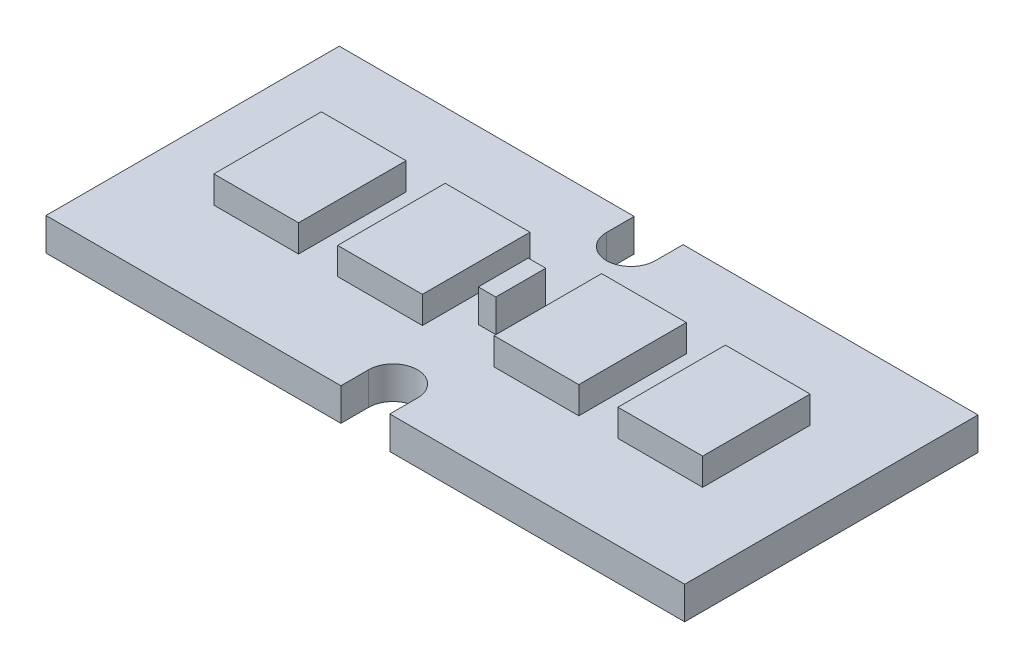
ISO-10303-21;
HEADER;
FILE_DESCRIPTION(('STEP AP214'),'2;1');
FILE_NAME('part.step','',(''),(''),'','','');
FILE_SCHEMA(('AUTOMOTIVE_DESIGN { 1 0 10303 214 1 1 1 1 }'));
ENDSEC;
DATA;
#1=APPLICATION_CONTEXT('core data for automotive mechanical design processes');
#2=APPLICATION_PROTOCOL_DEFINITION('international standard','automotive_design',2000,#1);
#3=PRODUCT_CONTEXT('',#1,'mechanical');
#4=PRODUCT('Part','Part','',(#3));
#5=PRODUCT_RELATED_PRODUCT_CATEGORY('part','',(#4));
#6=PRODUCT_DEFINITION_FORMATION('','',#4);
#7=PRODUCT_DEFINITION_CONTEXT('part definition',#1,'design');
#8=PRODUCT_DEFINITION('design','',#6,#7);
#9=PRODUCT_DEFINITION_SHAPE('','',#8);
#10=(LENGTH_UNIT() NAMED_UNIT(*) SI_UNIT(.MILLI.,.METRE.));
#11=(NAMED_UNIT(*) PLANE_ANGLE_UNIT() SI_UNIT($,.RADIAN.));
#12=(NAMED_UNIT(*) SI_UNIT($,.STERADIAN.) SOLID_ANGLE_UNIT());
#13=UNCERTAINTY_MEASURE_WITH_UNIT(LENGTH_MEASURE(1.E-05),#10,'distance_accuracy_value','');
#14=(GEOMETRIC_REPRESENTATION_CONTEXT(3) GLOBAL_UNCERTAINTY_ASSIGNED_CONTEXT((#13)) GLOBAL_UNIT_ASSIGNED_CONTEXT((#10,
#11,#12)) REPRESENTATION_CONTEXT('',''));
#15=CARTESIAN_POINT('',(0.,0.,0.));
#16=DIRECTION('',(0.,0.,1.));
#17=DIRECTION('',(1.,0.,0.));
#18=AXIS2_PLACEMENT_3D('',#15,#16,#17);
#19=CARTESIAN_POINT('',(0.,1.,0.));
#20=DIRECTION('',(0.,1.,0.));
#21=DIRECTION('',(0.,0.,1.));
#22=AXIS2_PLACEMENT_3D('',#19,#20,#21);
#23=PLANE('',#22);
#24=DIRECTION('',(0.,0.,1.));
#25=VECTOR('',#24,1.);
#26=CARTESIAN_POINT('',(7.5,1.,0.));
#27=LINE('',#26,#25);
#28=CARTESIAN_POINT('',(7.5,1.,-1.65));
#29=VERTEX_POINT('',#28);
#30=CARTESIAN_POINT('',(7.5,1.,1.65));
#31=VERTEX_POINT('',#30);
#32=EDGE_CURVE('E270',#29,#31,#27,.T.);
#33=ORIENTED_EDGE('',*,*,#32,.T.);
#34=DIRECTION('',(-1.,0.,0.));
#35=VECTOR('',#34,1.);
#36=CARTESIAN_POINT('',(0.,1.,1.65));
#37=LINE('',#36,#35);
#38=CARTESIAN_POINT('',(4.9,1.,1.65));
#39=VERTEX_POINT('',#38);
#40=EDGE_CURVE('E280',#31,#39,#37,.T.);
#41=ORIENTED_EDGE('',*,*,#40,.T.);
#42=DIRECTION('',(0.,0.,1.));
#43=VECTOR('',#42,1.);
#44=CARTESIAN_POINT('',(4.9,1.,0.));
#45=LINE('',#44,#43);
#46=CARTESIAN_POINT('',(4.9,1.,-1.65));
#47=VERTEX_POINT('',#46);
#48=EDGE_CURVE('E289',#47,#39,#45,.T.);
#49=ORIENTED_EDGE('',*,*,#48,.F.);
#50=DIRECTION('',(-1.,0.,0.));
#51=VECTOR('',#50,1.);
#52=CARTESIAN_POINT('',(0.,1.,-1.65));
#53=LINE('',#52,#51);
#54=EDGE_CURVE('E59',#29,#47,#53,.T.);
#55=ORIENTED_EDGE('',*,*,#54,.F.);
#56=EDGE_LOOP('',(#33,#41,#49,#55));
#57=FACE_BOUND('',#56,.T.);
#58=DIRECTION('',(0.,0.,1.));
#59=VECTOR('',#58,1.);
#60=CARTESIAN_POINT('',(3.7,1.,0.));
#61=LINE('',#60,#59);
#62=CARTESIAN_POINT('',(3.7,1.,-1.65));
#63=VERTEX_POINT('',#62);
#64=CARTESIAN_POINT('',(3.7,1.,1.65));
#65=VERTEX_POINT('',#64);
#66=EDGE_CURVE('E303',#63,#65,#61,.T.);
#67=ORIENTED_EDGE('',*,*,#66,.T.);
#68=DIRECTION('',(-1.,0.,0.));
#69=VECTOR('',#68,1.);
#70=CARTESIAN_POINT('',(0.,1.,1.65));
#71=LINE('',#70,#69);
#72=CARTESIAN_POINT('',(1.1,1.,1.65));
#73=VERTEX_POINT('',#72);
#74=EDGE_CURVE('E308',#65,#73,#71,.T.);
#75=ORIENTED_EDGE('',*,*,#74,.T.);
#76=DIRECTION('',(0.,0.,1.));
#77=VECTOR('',#76,1.);
#78=CARTESIAN_POINT('',(1.1,1.,0.));
#79=LINE('',#78,#77);
#80=CARTESIAN_POINT('',(1.1,1.,-1.65));
#81=VERTEX_POINT('',#80);
#82=EDGE_CURVE('E320',#81,#73,#79,.T.);
#83=ORIENTED_EDGE('',*,*,#82,.F.);
#84=DIRECTION('',(-1.,0.,0.));
#85=VECTOR('',#84,1.);
#86=CARTESIAN_POINT('',(0.,1.,-1.65));
#87=LINE('',#86,#85);
#88=EDGE_CURVE('E317',#63,#81,#87,.T.);
#89=ORIENTED_EDGE('',*,*,#88,.F.);
#90=EDGE_LOOP('',(#67,#75,#83,#89));
#91=FACE_BOUND('',#90,.T.);
#92=DIRECTION('',(0.,0.,1.));
#93=VECTOR('',#92,1.);
#94=CARTESIAN_POINT('',(-1.1,1.,0.));
#95=LINE('',#94,#93);
#96=CARTESIAN_POINT('',(-1.1,1.,-1.65));
#97=VERTEX_POINT('',#96);
#98=CARTESIAN_POINT('',(-1.1,1.,1.65));
#99=VERTEX_POINT('',#98);
#100=EDGE_CURVE('E335',#97,#99,#95,.T.);
#101=ORIENTED_EDGE('',*,*,#100,.T.);
#102=DIRECTION('',(1.,0.,0.));
#103=VECTOR('',#102,1.);
#104=CARTESIAN_POINT('',(0.,1.,1.65));
#105=LINE('',#104,#103);
#106=CARTESIAN_POINT('',(-3.7,1.,1.65));
#107=VERTEX_POINT('',#106);
#108=EDGE_CURVE('E340',#107,#99,#105,.T.);
#109=ORIENTED_EDGE('',*,*,#108,.F.);
#110=DIRECTION('',(0.,0.,1.));
#111=VECTOR('',#110,1.);
#112=CARTESIAN_POINT('',(-3.7,1.,0.));
#113=LINE('',#112,#111);
#114=CARTESIAN_POINT('',(-3.7,1.,-1.65));
#115=VERTEX_POINT('',#114);
#116=EDGE_CURVE('E353',#115,#107,#113,.T.);
#117=ORIENTED_EDGE('',*,*,#116,.F.);
#118=DIRECTION('',(1.,0.,0.));
#119=VECTOR('',#118,1.);
#120=CARTESIAN_POINT('',(0.,1.,-1.65));
#121=LINE('',#120,#119);
#122=EDGE_CURVE('E350',#115,#97,#121,.T.);
#123=ORIENTED_EDGE('',*,*,#122,.T.);
#124=EDGE_LOOP('',(#101,#109,#117,#123));
#125=FACE_BOUND('',#124,.T.);
#126=DIRECTION('',(0.,0.,1.));
#127=VECTOR('',#126,1.);
#128=CARTESIAN_POINT('',(-4.9,1.,0.));
#129=LINE('',#128,#127);
#130=CARTESIAN_POINT('',(-4.9,1.,-1.65));
#131=VERTEX_POINT('',#130);
#132=CARTESIAN_POINT('',(-4.9,1.,1.65));
#133=VERTEX_POINT('',#132);
#134=EDGE_CURVE('E365',#131,#133,#129,.T.);
#135=ORIENTED_EDGE('',*,*,#134,.T.);
#136=DIRECTION('',(1.,0.,0.));
#137=VECTOR('',#136,1.);
#138=CARTESIAN_POINT('',(0.,1.,1.65));
#139=LINE('',#138,#137);
#140=CARTESIAN_POINT('',(-7.5,1.,1.65));
#141=VERTEX_POINT('',#140);
#142=EDGE_CURVE('E370',#141,#133,#139,.T.);
#143=ORIENTED_EDGE('',*,*,#142,.F.);
#144=DIRECTION('',(0.,0.,1.));
#145=VECTOR('',#144,1.);
#146=CARTESIAN_POINT('',(-7.5,1.,0.));
#147=LINE('',#146,#145);
#148=CARTESIAN_POINT('',(-7.5,1.,-1.65));
#149=VERTEX_POINT('',#148);
#150=EDGE_CURVE('E383',#149,#141,#147,.T.);
#151=ORIENTED_EDGE('',*,*,#150,.F.);
#152=DIRECTION('',(1.,0.,0.));
#153=VECTOR('',#152,1.);
#154=CARTESIAN_POINT('',(0.,1.,-1.65));
#155=LINE('',#154,#153);
#156=EDGE_CURVE('E380',#149,#131,#155,.T.);
#157=ORIENTED_EDGE('',*,*,#156,.T.);
#158=EDGE_LOOP('',(#135,#143,#151,#157));
#159=FACE_BOUND('',#158,.T.);
#160=DIRECTION('',(0.,0.,1.));
#161=VECTOR('',#160,1.);
#162=CARTESIAN_POINT('',(-0.749999999999999,1.,0.));
#163=LINE('',#162,#161);
#164=CARTESIAN_POINT('',(-0.75,1.,-4.5));
#165=VERTEX_POINT('',#164);
#166=CARTESIAN_POINT('',(-0.75,1.,-3.65));
#167=VERTEX_POINT('',#166);
#168=EDGE_CURVE('E407',#165,#167,#163,.T.);
#169=ORIENTED_EDGE('',*,*,#168,.F.);
#170=DIRECTION('',(-1.,0.,0.));
#171=VECTOR('',#170,1.);
#172=CARTESIAN_POINT('',(-9.8,1.,-4.5));
#173=LINE('',#172,#171);
#174=CARTESIAN_POINT('',(-9.8,1.,-4.5));
#175=VERTEX_POINT('',#174);
#176=EDGE_CURVE('E451',#165,#175,#173,.T.);
#177=ORIENTED_EDGE('',*,*,#176,.T.);
#178=DIRECTION('',(0.,0.,1.));
#179=VECTOR('',#178,1.);
#180=CARTESIAN_POINT('',(-9.8,1.,-4.5));
#181=LINE('',#180,#179);
#182=CARTESIAN_POINT('',(-9.8,1.,4.5));
#183=VERTEX_POINT('',#182);
#184=EDGE_CURVE('E456',#175,#183,#181,.T.);
#185=ORIENTED_EDGE('',*,*,#184,.T.);
#186=DIRECTION('',(1.,0.,0.));
#187=VECTOR('',#186,1.);
#188=CARTESIAN_POINT('',(-9.8,1.,4.5));
#189=LINE('',#188,#187);
#190=CARTESIAN_POINT('',(-0.75,1.,4.5));
#191=VERTEX_POINT('',#190);
#192=EDGE_CURVE('E459',#183,#191,#189,.T.);
#193=ORIENTED_EDGE('',*,*,#192,.T.);
#194=DIRECTION('',(0.,0.,-1.));
#195=VECTOR('',#194,1.);
#196=CARTESIAN_POINT('',(-0.749999999999999,1.,0.));
#197=LINE('',#196,#195);
#198=CARTESIAN_POINT('',(-0.75,1.,3.65));
#199=VERTEX_POINT('',#198);
#200=EDGE_CURVE('E436',#191,#199,#197,.T.);
#201=ORIENTED_EDGE('',*,*,#200,.T.);
#202=CARTESIAN_POINT('',(0.,1.,3.65));
#203=DIRECTION('',(0.,1.,0.));
#204=DIRECTION('',(0.,0.,1.));
#205=AXIS2_PLACEMENT_3D('',#202,#203,#204);
#206=CIRCLE('',#205,0.75);
#207=CARTESIAN_POINT('',(0.75,1.,3.65));
#208=VERTEX_POINT('',#207);
#209=EDGE_CURVE('E395',#199,#208,#206,.F.);
#210=ORIENTED_EDGE('',*,*,#209,.T.);
#211=DIRECTION('',(0.,0.,-1.));
#212=VECTOR('',#211,1.);
#213=CARTESIAN_POINT('',(0.75,1.,0.));
#214=LINE('',#213,#212);
#215=CARTESIAN_POINT('',(0.75,1.,4.5));
#216=VERTEX_POINT('',#215);
#217=EDGE_CURVE('E428',#216,#208,#214,.T.);
#218=ORIENTED_EDGE('',*,*,#217,.F.);
#219=CARTESIAN_POINT('',(9.8,1.,4.5));
#220=VERTEX_POINT('',#219);
#221=EDGE_CURVE('E458',#216,#220,#189,.T.);
#222=ORIENTED_EDGE('',*,*,#221,.T.);
#223=DIRECTION('',(0.,0.,-1.));
#224=VECTOR('',#223,1.);
#225=CARTESIAN_POINT('',(9.8,1.,-4.5));
#226=LINE('',#225,#224);
#227=CARTESIAN_POINT('',(9.8,1.,-4.5));
#228=VERTEX_POINT('',#227);
#229=EDGE_CURVE('E448',#220,#228,#226,.T.);
#230=ORIENTED_EDGE('',*,*,#229,.T.);
#231=CARTESIAN_POINT('',(0.75,1.,-4.5));
#232=VERTEX_POINT('',#231);
#233=EDGE_CURVE('E453',#228,#232,#173,.T.);
#234=ORIENTED_EDGE('',*,*,#233,.T.);
#235=DIRECTION('',(0.,0.,1.));
#236=VECTOR('',#235,1.);
#237=CARTESIAN_POINT('',(0.75,1.,0.));
#238=LINE('',#237,#236);
#239=CARTESIAN_POINT('',(0.75,1.,-3.65));
#240=VERTEX_POINT('',#239);
#241=EDGE_CURVE('E400',#232,#240,#238,.T.);
#242=ORIENTED_EDGE('',*,*,#241,.T.);
#243=CARTESIAN_POINT('',(0.,1.,-3.65));
#244=DIRECTION('',(0.,1.,0.));
#245=DIRECTION('',(0.,0.,1.));
#246=AXIS2_PLACEMENT_3D('',#243,#244,#245);
#247=CIRCLE('',#246,0.75);
#248=EDGE_CURVE('E410',#167,#240,#247,.T.);
#249=ORIENTED_EDGE('',*,*,#248,.F.);
#250=EDGE_LOOP('',(#169,#177,#185,#193,#201,#210,#218,#222,#230,#234,#242,#249));
#251=FACE_BOUND('',#250,.T.);
#252=DIRECTION('',(-1.,0.,0.));
#253=VECTOR('',#252,1.);
#254=CARTESIAN_POINT('',(-0.268785812417193,1.,-0.765005773802785));
#255=LINE('',#254,#253);
#256=CARTESIAN_POINT('',(0.268785812417193,1.,-0.765005773802785));
#257=VERTEX_POINT('',#256);
#258=CARTESIAN_POINT('',(-0.268785812417193,1.,-0.765005773802785));
#259=VERTEX_POINT('',#258);
#260=EDGE_CURVE('E890',#257,#259,#255,.T.);
#261=ORIENTED_EDGE('',*,*,#260,.F.);
#262=DIRECTION('',(0.,0.,-1.));
#263=VECTOR('',#262,1.);
#264=CARTESIAN_POINT('',(0.268785812417193,1.,-0.765005773802785));
#265=LINE('',#264,#263);
#266=CARTESIAN_POINT('',(0.268785812417193,1.,0.765005773802785));
#267=VERTEX_POINT('',#266);
#268=EDGE_CURVE('E268',#267,#257,#265,.T.);
#269=ORIENTED_EDGE('',*,*,#268,.F.);
#270=DIRECTION('',(1.,0.,0.));
#271=VECTOR('',#270,1.);
#272=CARTESIAN_POINT('',(-0.268785812417193,1.,0.765005773802785));
#273=LINE('',#272,#271);
#274=CARTESIAN_POINT('',(-0.268785812417193,1.,0.765005773802785));
#275=VERTEX_POINT('',#274);
#276=EDGE_CURVE('E264',#275,#267,#273,.T.);
#277=ORIENTED_EDGE('',*,*,#276,.F.);
#278=DIRECTION('',(0.,0.,1.));
#279=VECTOR('',#278,1.);
#280=CARTESIAN_POINT('',(-0.268785812417193,1.,-0.765005773802785));
#281=LINE('',#280,#279);
#282=EDGE_CURVE('E887',#259,#275,#281,.T.);
#283=ORIENTED_EDGE('',*,*,#282,.F.);
#284=EDGE_LOOP('',(#261,#269,#277,#283));
#285=FACE_BOUND('',#284,.T.);
#286=ADVANCED_FACE('F36',(#57,#91,#125,#159,#251,#285),#23,.T.);
#287=CARTESIAN_POINT('',(-9.8,1.,-4.5));
#288=DIRECTION('',(0.,0.,1.));
#289=DIRECTION('',(1.,0.,0.));
#290=AXIS2_PLACEMENT_3D('',#287,#288,#289);
#291=PLANE('',#290);
#292=DIRECTION('',(0.,1.,0.));
#293=VECTOR('',#292,1.);
#294=CARTESIAN_POINT('',(0.75,0.,-4.5));
#295=LINE('',#294,#293);
#296=CARTESIAN_POINT('',(0.75,0.,-4.5));
#297=VERTEX_POINT('',#296);
#298=EDGE_CURVE('E419',#297,#232,#295,.T.);
#299=ORIENTED_EDGE('',*,*,#298,.T.);
#300=ORIENTED_EDGE('',*,*,#233,.F.);
#301=DIRECTION('',(0.,-1.,0.));
#302=VECTOR('',#301,1.);
#303=CARTESIAN_POINT('',(9.8,1.,-4.5));
#304=LINE('',#303,#302);
#305=CARTESIAN_POINT('',(9.8,0.,-4.5));
#306=VERTEX_POINT('',#305);
#307=EDGE_CURVE('E11',#228,#306,#304,.T.);
#308=ORIENTED_EDGE('',*,*,#307,.T.);
#309=DIRECTION('',(-1.,0.,0.));
#310=VECTOR('',#309,1.);
#311=CARTESIAN_POINT('',(-9.8,0.,-4.5));
#312=LINE('',#311,#310);
#313=EDGE_CURVE('E466',#306,#297,#312,.T.);
#314=ORIENTED_EDGE('',*,*,#313,.T.);
#315=EDGE_LOOP('',(#299,#300,#308,#314));
#316=FACE_BOUND('',#315,.T.);
#317=ADVANCED_FACE('F511',(#316),#291,.F.);
#318=CARTESIAN_POINT('',(-9.8,1.,4.5));
#319=DIRECTION('',(0.,0.,-1.));
#320=DIRECTION('',(-1.,0.,0.));
#321=AXIS2_PLACEMENT_3D('',#318,#319,#320);
#322=PLANE('',#321);
#323=DIRECTION('',(0.,1.,0.));
#324=VECTOR('',#323,1.);
#325=CARTESIAN_POINT('',(-0.75,0.,4.5));
#326=LINE('',#325,#324);
#327=CARTESIAN_POINT('',(-0.750000000000001,0.,4.5));
#328=VERTEX_POINT('',#327);
#329=EDGE_CURVE('E444',#328,#191,#326,.T.);
#330=ORIENTED_EDGE('',*,*,#329,.T.);
#331=ORIENTED_EDGE('',*,*,#192,.F.);
#332=DIRECTION('',(0.,-1.,0.));
#333=VECTOR('',#332,1.);
#334=CARTESIAN_POINT('',(-9.8,1.,4.5));
#335=LINE('',#334,#333);
#336=CARTESIAN_POINT('',(-9.8,0.,4.5));
#337=VERTEX_POINT('',#336);
#338=EDGE_CURVE('E476',#183,#337,#335,.T.);
#339=ORIENTED_EDGE('',*,*,#338,.T.);
#340=DIRECTION('',(1.,0.,0.));
#341=VECTOR('',#340,1.);
#342=CARTESIAN_POINT('',(-9.8,0.,4.5));
#343=LINE('',#342,#341);
#344=EDGE_CURVE('E452',#337,#328,#343,.T.);
#345=ORIENTED_EDGE('',*,*,#344,.T.);
#346=EDGE_LOOP('',(#330,#331,#339,#345));
#347=FACE_BOUND('',#346,.T.);
#348=ADVANCED_FACE('F494',(#347),#322,.F.);
#349=CARTESIAN_POINT('',(9.8,1.,-4.5));
#350=DIRECTION('',(-1.,0.,0.));
#351=DIRECTION('',(0.,0.,1.));
#352=AXIS2_PLACEMENT_3D('',#349,#350,#351);
#353=PLANE('',#352);
#354=DIRECTION('',(0.,0.,-1.));
#355=VECTOR('',#354,1.);
#356=CARTESIAN_POINT('',(9.8,0.,-4.5));
#357=LINE('',#356,#355);
#358=CARTESIAN_POINT('',(9.8,0.,4.5));
#359=VERTEX_POINT('',#358);
#360=EDGE_CURVE('E418',#359,#306,#357,.T.);
#361=ORIENTED_EDGE('',*,*,#360,.T.);
#362=ORIENTED_EDGE('',*,*,#307,.F.);
#363=ORIENTED_EDGE('',*,*,#229,.F.);
#364=DIRECTION('',(0.,-1.,0.));
#365=VECTOR('',#364,1.);
#366=CARTESIAN_POINT('',(9.8,1.,4.5));
#367=LINE('',#366,#365);
#368=EDGE_CURVE('E462',#220,#359,#367,.T.);
#369=ORIENTED_EDGE('',*,*,#368,.T.);
#370=EDGE_LOOP('',(#361,#362,#363,#369));
#371=FACE_BOUND('',#370,.T.);
#372=ADVANCED_FACE('F38',(#371),#353,.F.);
#373=ORIENTED_EDGE('',*,*,#176,.F.);
#374=DIRECTION('',(0.,1.,0.));
#375=VECTOR('',#374,1.);
#376=CARTESIAN_POINT('',(-0.75,0.,-4.5));
#377=LINE('',#376,#375);
#378=CARTESIAN_POINT('',(-0.75,0.,-4.5));
#379=VERTEX_POINT('',#378);
#380=EDGE_CURVE('E416',#379,#165,#377,.T.);
#381=ORIENTED_EDGE('',*,*,#380,.F.);
#382=CARTESIAN_POINT('',(-9.8,0.,-4.5));
#383=VERTEX_POINT('',#382);
#384=EDGE_CURVE('E465',#379,#383,#312,.T.);
#385=ORIENTED_EDGE('',*,*,#384,.T.);
#386=DIRECTION('',(0.,-1.,0.));
#387=VECTOR('',#386,1.);
#388=CARTESIAN_POINT('',(-9.8,1.,-4.5));
#389=LINE('',#388,#387);
#390=EDGE_CURVE('E44',#175,#383,#389,.T.);
#391=ORIENTED_EDGE('',*,*,#390,.F.);
#392=EDGE_LOOP('',(#373,#381,#385,#391));
#393=FACE_BOUND('',#392,.T.);
#394=ADVANCED_FACE('F501',(#393),#291,.F.);
#395=CARTESIAN_POINT('',(-9.8,1.,-4.5));
#396=DIRECTION('',(1.,0.,0.));
#397=DIRECTION('',(0.,0.,-1.));
#398=AXIS2_PLACEMENT_3D('',#395,#396,#397);
#399=PLANE('',#398);
#400=DIRECTION('',(0.,0.,1.));
#401=VECTOR('',#400,1.);
#402=CARTESIAN_POINT('',(-9.8,0.,-4.5));
#403=LINE('',#402,#401);
#404=EDGE_CURVE('E469',#383,#337,#403,.T.);
#405=ORIENTED_EDGE('',*,*,#404,.T.);
#406=ORIENTED_EDGE('',*,*,#338,.F.);
#407=ORIENTED_EDGE('',*,*,#184,.F.);
#408=ORIENTED_EDGE('',*,*,#390,.T.);
#409=EDGE_LOOP('',(#405,#406,#407,#408));
#410=FACE_BOUND('',#409,.T.);
#411=ADVANCED_FACE('F483',(#410),#399,.F.);
#412=ORIENTED_EDGE('',*,*,#221,.F.);
#413=DIRECTION('',(0.,1.,0.));
#414=VECTOR('',#413,1.);
#415=CARTESIAN_POINT('',(0.75,0.,4.5));
#416=LINE('',#415,#414);
#417=CARTESIAN_POINT('',(0.75,0.,4.5));
#418=VERTEX_POINT('',#417);
#419=EDGE_CURVE('E442',#418,#216,#416,.T.);
#420=ORIENTED_EDGE('',*,*,#419,.F.);
#421=EDGE_CURVE('E471',#418,#359,#343,.T.);
#422=ORIENTED_EDGE('',*,*,#421,.T.);
#423=ORIENTED_EDGE('',*,*,#368,.F.);
#424=EDGE_LOOP('',(#412,#420,#422,#423));
#425=FACE_BOUND('',#424,.T.);
#426=ADVANCED_FACE('F522',(#425),#322,.F.);
#427=CARTESIAN_POINT('',(0.,0.,0.));
#428=DIRECTION('',(0.,1.,0.));
#429=DIRECTION('',(0.,0.,1.));
#430=AXIS2_PLACEMENT_3D('',#427,#428,#429);
#431=PLANE('',#430);
#432=ORIENTED_EDGE('',*,*,#384,.F.);
#433=DIRECTION('',(0.,0.,1.));
#434=VECTOR('',#433,1.);
#435=CARTESIAN_POINT('',(-0.749999999999999,0.,0.));
#436=LINE('',#435,#434);
#437=CARTESIAN_POINT('',(-0.75,0.,-3.65));
#438=VERTEX_POINT('',#437);
#439=EDGE_CURVE('E396',#379,#438,#436,.T.);
#440=ORIENTED_EDGE('',*,*,#439,.T.);
#441=CARTESIAN_POINT('',(0.,0.,-3.65));
#442=DIRECTION('',(0.,1.,0.));
#443=DIRECTION('',(0.,0.,1.));
#444=AXIS2_PLACEMENT_3D('',#441,#442,#443);
#445=CIRCLE('',#444,0.75);
#446=CARTESIAN_POINT('',(0.75,0.,-3.65));
#447=VERTEX_POINT('',#446);
#448=EDGE_CURVE('E399',#438,#447,#445,.T.);
#449=ORIENTED_EDGE('',*,*,#448,.T.);
#450=DIRECTION('',(0.,0.,1.));
#451=VECTOR('',#450,1.);
#452=CARTESIAN_POINT('',(0.75,0.,0.));
#453=LINE('',#452,#451);
#454=EDGE_CURVE('E403',#297,#447,#453,.T.);
#455=ORIENTED_EDGE('',*,*,#454,.F.);
#456=ORIENTED_EDGE('',*,*,#313,.F.);
#457=ORIENTED_EDGE('',*,*,#360,.F.);
#458=ORIENTED_EDGE('',*,*,#421,.F.);
#459=DIRECTION('',(0.,0.,-1.));
#460=VECTOR('',#459,1.);
#461=CARTESIAN_POINT('',(0.75,0.,0.));
#462=LINE('',#461,#460);
#463=CARTESIAN_POINT('',(0.75,0.,3.65));
#464=VERTEX_POINT('',#463);
#465=EDGE_CURVE('E430',#418,#464,#462,.T.);
#466=ORIENTED_EDGE('',*,*,#465,.T.);
#467=CARTESIAN_POINT('',(0.,0.,3.65));
#468=DIRECTION('',(0.,1.,0.));
#469=DIRECTION('',(0.,0.,1.));
#470=AXIS2_PLACEMENT_3D('',#467,#468,#469);
#471=CIRCLE('',#470,0.75);
#472=CARTESIAN_POINT('',(-0.75,0.,3.65));
#473=VERTEX_POINT('',#472);
#474=EDGE_CURVE('E425',#473,#464,#471,.F.);
#475=ORIENTED_EDGE('',*,*,#474,.F.);
#476=DIRECTION('',(0.,0.,-1.));
#477=VECTOR('',#476,1.);
#478=CARTESIAN_POINT('',(-0.749999999999999,0.,0.));
#479=LINE('',#478,#477);
#480=EDGE_CURVE('E427',#328,#473,#479,.T.);
#481=ORIENTED_EDGE('',*,*,#480,.F.);
#482=ORIENTED_EDGE('',*,*,#344,.F.);
#483=ORIENTED_EDGE('',*,*,#404,.F.);
#484=EDGE_LOOP('',(#432,#440,#449,#455,#456,#457,#458,#466,#475,#481,#482,#483));
#485=FACE_BOUND('',#484,.T.);
#486=ADVANCED_FACE('F490',(#485),#431,.F.);
#487=CARTESIAN_POINT('',(0.,0.,3.65));
#488=DIRECTION('',(0.,1.,0.));
#489=DIRECTION('',(0.,0.,1.));
#490=AXIS2_PLACEMENT_3D('',#487,#488,#489);
#491=CYLINDRICAL_SURFACE('',#490,0.75);
#492=ORIENTED_EDGE('',*,*,#209,.F.);
#493=DIRECTION('',(0.,1.,0.));
#494=VECTOR('',#493,1.);
#495=CARTESIAN_POINT('',(-0.75,0.,3.65));
#496=LINE('',#495,#494);
#497=EDGE_CURVE('E433',#473,#199,#496,.T.);
#498=ORIENTED_EDGE('',*,*,#497,.F.);
#499=ORIENTED_EDGE('',*,*,#474,.T.);
#500=DIRECTION('',(0.,1.,0.));
#501=VECTOR('',#500,1.);
#502=CARTESIAN_POINT('',(0.75,0.,3.65));
#503=LINE('',#502,#501);
#504=EDGE_CURVE('E411',#464,#208,#503,.T.);
#505=ORIENTED_EDGE('',*,*,#504,.T.);
#506=EDGE_LOOP('',(#492,#498,#499,#505));
#507=FACE_BOUND('',#506,.T.);
#508=ADVANCED_FACE('F529',(#507),#491,.F.);
#509=CARTESIAN_POINT('',(0.75,0.,0.));
#510=DIRECTION('',(1.,0.,0.));
#511=DIRECTION('',(0.,0.,-1.));
#512=AXIS2_PLACEMENT_3D('',#509,#510,#511);
#513=PLANE('',#512);
#514=ORIENTED_EDGE('',*,*,#217,.T.);
#515=ORIENTED_EDGE('',*,*,#504,.F.);
#516=ORIENTED_EDGE('',*,*,#465,.F.);
#517=ORIENTED_EDGE('',*,*,#419,.T.);
#518=EDGE_LOOP('',(#514,#515,#516,#517));
#519=FACE_BOUND('',#518,.T.);
#520=ADVANCED_FACE('F524',(#519),#513,.F.);
#521=CARTESIAN_POINT('',(-0.749999999999999,0.,0.));
#522=DIRECTION('',(1.,0.,0.));
#523=DIRECTION('',(0.,0.,-1.));
#524=AXIS2_PLACEMENT_3D('',#521,#522,#523);
#525=PLANE('',#524);
#526=ORIENTED_EDGE('',*,*,#200,.F.);
#527=ORIENTED_EDGE('',*,*,#329,.F.);
#528=ORIENTED_EDGE('',*,*,#480,.T.);
#529=ORIENTED_EDGE('',*,*,#497,.T.);
#530=EDGE_LOOP('',(#526,#527,#528,#529));
#531=FACE_BOUND('',#530,.T.);
#532=ADVANCED_FACE('F531',(#531),#525,.T.);
#533=CARTESIAN_POINT('',(-0.749999999999999,0.,0.));
#534=DIRECTION('',(-1.,0.,0.));
#535=DIRECTION('',(0.,0.,1.));
#536=AXIS2_PLACEMENT_3D('',#533,#534,#535);
#537=PLANE('',#536);
#538=ORIENTED_EDGE('',*,*,#168,.T.);
#539=DIRECTION('',(0.,1.,0.));
#540=VECTOR('',#539,1.);
#541=CARTESIAN_POINT('',(-0.75,0.,-3.65));
#542=LINE('',#541,#540);
#543=EDGE_CURVE('E406',#438,#167,#542,.T.);
#544=ORIENTED_EDGE('',*,*,#543,.F.);
#545=ORIENTED_EDGE('',*,*,#439,.F.);
#546=ORIENTED_EDGE('',*,*,#380,.T.);
#547=EDGE_LOOP('',(#538,#544,#545,#546));
#548=FACE_BOUND('',#547,.T.);
#549=ADVANCED_FACE('F503',(#548),#537,.F.);
#550=CARTESIAN_POINT('',(0.75,0.,0.));
#551=DIRECTION('',(-1.,0.,0.));
#552=DIRECTION('',(0.,0.,1.));
#553=AXIS2_PLACEMENT_3D('',#550,#551,#552);
#554=PLANE('',#553);
#555=ORIENTED_EDGE('',*,*,#241,.F.);
#556=ORIENTED_EDGE('',*,*,#298,.F.);
#557=ORIENTED_EDGE('',*,*,#454,.T.);
#558=DIRECTION('',(0.,1.,0.));
#559=VECTOR('',#558,1.);
#560=CARTESIAN_POINT('',(0.75,0.,-3.65));
#561=LINE('',#560,#559);
#562=EDGE_CURVE('E422',#447,#240,#561,.T.);
#563=ORIENTED_EDGE('',*,*,#562,.T.);
#564=EDGE_LOOP('',(#555,#556,#557,#563));
#565=FACE_BOUND('',#564,.T.);
#566=ADVANCED_FACE('F509',(#565),#554,.T.);
#567=CARTESIAN_POINT('',(0.,0.,-3.65));
#568=DIRECTION('',(0.,1.,0.));
#569=DIRECTION('',(0.,0.,1.));
#570=AXIS2_PLACEMENT_3D('',#567,#568,#569);
#571=CYLINDRICAL_SURFACE('',#570,0.75);
#572=ORIENTED_EDGE('',*,*,#248,.T.);
#573=ORIENTED_EDGE('',*,*,#562,.F.);
#574=ORIENTED_EDGE('',*,*,#448,.F.);
#575=ORIENTED_EDGE('',*,*,#543,.T.);
#576=EDGE_LOOP('',(#572,#573,#574,#575));
#577=FACE_BOUND('',#576,.T.);
#578=ADVANCED_FACE('F507',(#577),#571,.F.);
#579=CARTESIAN_POINT('',(-4.9,1.83,0.));
#580=DIRECTION('',(1.,0.,0.));
#581=DIRECTION('',(0.,0.,-1.));
#582=AXIS2_PLACEMENT_3D('',#579,#580,#581);
#583=PLANE('',#582);
#584=ORIENTED_EDGE('',*,*,#134,.F.);
#585=DIRECTION('',(0.,-1.,0.));
#586=VECTOR('',#585,1.);
#587=CARTESIAN_POINT('',(-4.9,1.83,-1.65));
#588=LINE('',#587,#586);
#589=CARTESIAN_POINT('',(-4.9,1.83,-1.65));
#590=VERTEX_POINT('',#589);
#591=EDGE_CURVE('E393',#590,#131,#588,.T.);
#592=ORIENTED_EDGE('',*,*,#591,.F.);
#593=DIRECTION('',(0.,0.,1.));
#594=VECTOR('',#593,1.);
#595=CARTESIAN_POINT('',(-4.9,1.83,0.));
#596=LINE('',#595,#594);
#597=CARTESIAN_POINT('',(-4.9,1.83,1.65));
#598=VERTEX_POINT('',#597);
#599=EDGE_CURVE('E366',#590,#598,#596,.T.);
#600=ORIENTED_EDGE('',*,*,#599,.T.);
#601=DIRECTION('',(0.,-1.,0.));
#602=VECTOR('',#601,1.);
#603=CARTESIAN_POINT('',(-4.9,1.83,1.65));
#604=LINE('',#603,#602);
#605=EDGE_CURVE('E377',#598,#133,#604,.T.);
#606=ORIENTED_EDGE('',*,*,#605,.T.);
#607=EDGE_LOOP('',(#584,#592,#600,#606));
#608=FACE_BOUND('',#607,.T.);
#609=ADVANCED_FACE('F632',(#608),#583,.T.);
#610=CARTESIAN_POINT('',(0.,1.83,-1.65));
#611=DIRECTION('',(0.,0.,-1.));
#612=DIRECTION('',(-1.,0.,0.));
#613=AXIS2_PLACEMENT_3D('',#610,#611,#612);
#614=PLANE('',#613);
#615=ORIENTED_EDGE('',*,*,#156,.F.);
#616=DIRECTION('',(0.,-1.,0.));
#617=VECTOR('',#616,1.);
#618=CARTESIAN_POINT('',(-7.5,1.83,-1.65));
#619=LINE('',#618,#617);
#620=CARTESIAN_POINT('',(-7.5,1.83,-1.65));
#621=VERTEX_POINT('',#620);
#622=EDGE_CURVE('E391',#621,#149,#619,.T.);
#623=ORIENTED_EDGE('',*,*,#622,.F.);
#624=DIRECTION('',(1.,0.,0.));
#625=VECTOR('',#624,1.);
#626=CARTESIAN_POINT('',(0.,1.83,-1.65));
#627=LINE('',#626,#625);
#628=EDGE_CURVE('E369',#621,#590,#627,.T.);
#629=ORIENTED_EDGE('',*,*,#628,.T.);
#630=ORIENTED_EDGE('',*,*,#591,.T.);
#631=EDGE_LOOP('',(#615,#623,#629,#630));
#632=FACE_BOUND('',#631,.T.);
#633=ADVANCED_FACE('F641',(#632),#614,.T.);
#634=CARTESIAN_POINT('',(-7.5,1.83,0.));
#635=DIRECTION('',(1.,0.,0.));
#636=DIRECTION('',(0.,0.,-1.));
#637=AXIS2_PLACEMENT_3D('',#634,#635,#636);
#638=PLANE('',#637);
#639=ORIENTED_EDGE('',*,*,#150,.T.);
#640=DIRECTION('',(0.,-1.,0.));
#641=VECTOR('',#640,1.);
#642=CARTESIAN_POINT('',(-7.5,1.83,1.65));
#643=LINE('',#642,#641);
#644=CARTESIAN_POINT('',(-7.5,1.83,1.65));
#645=VERTEX_POINT('',#644);
#646=EDGE_CURVE('E389',#645,#141,#643,.T.);
#647=ORIENTED_EDGE('',*,*,#646,.F.);
#648=DIRECTION('',(0.,0.,1.));
#649=VECTOR('',#648,1.);
#650=CARTESIAN_POINT('',(-7.5,1.83,0.));
#651=LINE('',#650,#649);
#652=EDGE_CURVE('E373',#621,#645,#651,.T.);
#653=ORIENTED_EDGE('',*,*,#652,.F.);
#654=ORIENTED_EDGE('',*,*,#622,.T.);
#655=EDGE_LOOP('',(#639,#647,#653,#654));
#656=FACE_BOUND('',#655,.T.);
#657=ADVANCED_FACE('F651',(#656),#638,.F.);
#658=CARTESIAN_POINT('',(0.,1.83,1.65));
#659=DIRECTION('',(0.,0.,-1.));
#660=DIRECTION('',(-1.,0.,0.));
#661=AXIS2_PLACEMENT_3D('',#658,#659,#660);
#662=PLANE('',#661);
#663=ORIENTED_EDGE('',*,*,#142,.T.);
#664=ORIENTED_EDGE('',*,*,#605,.F.);
#665=DIRECTION('',(1.,0.,0.));
#666=VECTOR('',#665,1.);
#667=CARTESIAN_POINT('',(0.,1.83,1.65));
#668=LINE('',#667,#666);
#669=EDGE_CURVE('E375',#645,#598,#668,.T.);
#670=ORIENTED_EDGE('',*,*,#669,.F.);
#671=ORIENTED_EDGE('',*,*,#646,.T.);
#672=EDGE_LOOP('',(#663,#664,#670,#671));
#673=FACE_BOUND('',#672,.T.);
#674=ADVANCED_FACE('F661',(#673),#662,.F.);
#675=CARTESIAN_POINT('',(0.,1.83,0.));
#676=DIRECTION('',(0.,1.,0.));
#677=DIRECTION('',(0.,0.,1.));
#678=AXIS2_PLACEMENT_3D('',#675,#676,#677);
#679=PLANE('',#678);
#680=ORIENTED_EDGE('',*,*,#599,.F.);
#681=ORIENTED_EDGE('',*,*,#628,.F.);
#682=ORIENTED_EDGE('',*,*,#652,.T.);
#683=ORIENTED_EDGE('',*,*,#669,.T.);
#684=EDGE_LOOP('',(#680,#681,#682,#683));
#685=FACE_BOUND('',#684,.T.);
#686=ADVANCED_FACE('F671',(#685),#679,.T.);
#687=CARTESIAN_POINT('',(-1.1,1.83,0.));
#688=DIRECTION('',(1.,0.,0.));
#689=DIRECTION('',(0.,0.,-1.));
#690=AXIS2_PLACEMENT_3D('',#687,#688,#689);
#691=PLANE('',#690);
#692=ORIENTED_EDGE('',*,*,#100,.F.);
#693=DIRECTION('',(0.,-1.,0.));
#694=VECTOR('',#693,1.);
#695=CARTESIAN_POINT('',(-1.1,1.83,-1.65));
#696=LINE('',#695,#694);
#697=CARTESIAN_POINT('',(-1.1,1.83,-1.65));
#698=VERTEX_POINT('',#697);
#699=EDGE_CURVE('E363',#698,#97,#696,.T.);
#700=ORIENTED_EDGE('',*,*,#699,.F.);
#701=DIRECTION('',(0.,0.,1.));
#702=VECTOR('',#701,1.);
#703=CARTESIAN_POINT('',(-1.1,1.83,0.));
#704=LINE('',#703,#702);
#705=CARTESIAN_POINT('',(-1.1,1.83,1.65));
#706=VERTEX_POINT('',#705);
#707=EDGE_CURVE('E336',#698,#706,#704,.T.);
#708=ORIENTED_EDGE('',*,*,#707,.T.);
#709=DIRECTION('',(0.,-1.,0.));
#710=VECTOR('',#709,1.);
#711=CARTESIAN_POINT('',(-1.1,1.83,1.65));
#712=LINE('',#711,#710);
#713=EDGE_CURVE('E347',#706,#99,#712,.T.);
#714=ORIENTED_EDGE('',*,*,#713,.T.);
#715=EDGE_LOOP('',(#692,#700,#708,#714));
#716=FACE_BOUND('',#715,.T.);
#717=ADVANCED_FACE('F682',(#716),#691,.T.);
#718=CARTESIAN_POINT('',(0.,1.83,-1.65));
#719=DIRECTION('',(0.,0.,-1.));
#720=DIRECTION('',(-1.,0.,0.));
#721=AXIS2_PLACEMENT_3D('',#718,#719,#720);
#722=PLANE('',#721);
#723=ORIENTED_EDGE('',*,*,#122,.F.);
#724=DIRECTION('',(0.,-1.,0.));
#725=VECTOR('',#724,1.);
#726=CARTESIAN_POINT('',(-3.7,1.83,-1.65));
#727=LINE('',#726,#725);
#728=CARTESIAN_POINT('',(-3.7,1.83,-1.65));
#729=VERTEX_POINT('',#728);
#730=EDGE_CURVE('E361',#729,#115,#727,.T.);
#731=ORIENTED_EDGE('',*,*,#730,.F.);
#732=DIRECTION('',(1.,0.,0.));
#733=VECTOR('',#732,1.);
#734=CARTESIAN_POINT('',(0.,1.83,-1.65));
#735=LINE('',#734,#733);
#736=EDGE_CURVE('E339',#729,#698,#735,.T.);
#737=ORIENTED_EDGE('',*,*,#736,.T.);
#738=ORIENTED_EDGE('',*,*,#699,.T.);
#739=EDGE_LOOP('',(#723,#731,#737,#738));
#740=FACE_BOUND('',#739,.T.);
#741=ADVANCED_FACE('F692',(#740),#722,.T.);
#742=CARTESIAN_POINT('',(-3.7,1.83,0.));
#743=DIRECTION('',(1.,0.,0.));
#744=DIRECTION('',(0.,0.,-1.));
#745=AXIS2_PLACEMENT_3D('',#742,#743,#744);
#746=PLANE('',#745);
#747=ORIENTED_EDGE('',*,*,#116,.T.);
#748=DIRECTION('',(0.,-1.,0.));
#749=VECTOR('',#748,1.);
#750=CARTESIAN_POINT('',(-3.7,1.83,1.65));
#751=LINE('',#750,#749);
#752=CARTESIAN_POINT('',(-3.7,1.83,1.65));
#753=VERTEX_POINT('',#752);
#754=EDGE_CURVE('E359',#753,#107,#751,.T.);
#755=ORIENTED_EDGE('',*,*,#754,.F.);
#756=DIRECTION('',(0.,0.,1.));
#757=VECTOR('',#756,1.);
#758=CARTESIAN_POINT('',(-3.7,1.83,0.));
#759=LINE('',#758,#757);
#760=EDGE_CURVE('E343',#729,#753,#759,.T.);
#761=ORIENTED_EDGE('',*,*,#760,.F.);
#762=ORIENTED_EDGE('',*,*,#730,.T.);
#763=EDGE_LOOP('',(#747,#755,#761,#762));
#764=FACE_BOUND('',#763,.T.);
#765=ADVANCED_FACE('F702',(#764),#746,.F.);
#766=CARTESIAN_POINT('',(0.,1.83,1.65));
#767=DIRECTION('',(0.,0.,-1.));
#768=DIRECTION('',(-1.,0.,0.));
#769=AXIS2_PLACEMENT_3D('',#766,#767,#768);
#770=PLANE('',#769);
#771=ORIENTED_EDGE('',*,*,#108,.T.);
#772=ORIENTED_EDGE('',*,*,#713,.F.);
#773=DIRECTION('',(1.,0.,0.));
#774=VECTOR('',#773,1.);
#775=CARTESIAN_POINT('',(0.,1.83,1.65));
#776=LINE('',#775,#774);
#777=EDGE_CURVE('E345',#753,#706,#776,.T.);
#778=ORIENTED_EDGE('',*,*,#777,.F.);
#779=ORIENTED_EDGE('',*,*,#754,.T.);
#780=EDGE_LOOP('',(#771,#772,#778,#779));
#781=FACE_BOUND('',#780,.T.);
#782=ADVANCED_FACE('F712',(#781),#770,.F.);
#783=CARTESIAN_POINT('',(0.,1.83,0.));
#784=DIRECTION('',(0.,1.,0.));
#785=DIRECTION('',(0.,0.,1.));
#786=AXIS2_PLACEMENT_3D('',#783,#784,#785);
#787=PLANE('',#786);
#788=ORIENTED_EDGE('',*,*,#707,.F.);
#789=ORIENTED_EDGE('',*,*,#736,.F.);
#790=ORIENTED_EDGE('',*,*,#760,.T.);
#791=ORIENTED_EDGE('',*,*,#777,.T.);
#792=EDGE_LOOP('',(#788,#789,#790,#791));
#793=FACE_BOUND('',#792,.T.);
#794=ADVANCED_FACE('F722',(#793),#787,.T.);
#795=CARTESIAN_POINT('',(3.7,1.83,0.));
#796=DIRECTION('',(1.,0.,0.));
#797=DIRECTION('',(0.,0.,-1.));
#798=AXIS2_PLACEMENT_3D('',#795,#796,#797);
#799=PLANE('',#798);
#800=ORIENTED_EDGE('',*,*,#66,.F.);
#801=DIRECTION('',(0.,-1.,0.));
#802=VECTOR('',#801,1.);
#803=CARTESIAN_POINT('',(3.7,1.83,-1.65));
#804=LINE('',#803,#802);
#805=CARTESIAN_POINT('',(3.7,1.83,-1.65));
#806=VERTEX_POINT('',#805);
#807=EDGE_CURVE('E332',#806,#63,#804,.T.);
#808=ORIENTED_EDGE('',*,*,#807,.F.);
#809=DIRECTION('',(0.,0.,1.));
#810=VECTOR('',#809,1.);
#811=CARTESIAN_POINT('',(3.7,1.83,0.));
#812=LINE('',#811,#810);
#813=CARTESIAN_POINT('',(3.7,1.83,1.65));
#814=VERTEX_POINT('',#813);
#815=EDGE_CURVE('E304',#806,#814,#812,.T.);
#816=ORIENTED_EDGE('',*,*,#815,.T.);
#817=DIRECTION('',(0.,-1.,0.));
#818=VECTOR('',#817,1.);
#819=CARTESIAN_POINT('',(3.7,1.83,1.65));
#820=LINE('',#819,#818);
#821=EDGE_CURVE('E315',#814,#65,#820,.T.);
#822=ORIENTED_EDGE('',*,*,#821,.T.);
#823=EDGE_LOOP('',(#800,#808,#816,#822));
#824=FACE_BOUND('',#823,.T.);
#825=ADVANCED_FACE('F733',(#824),#799,.T.);
#826=CARTESIAN_POINT('',(0.,1.83,-1.65));
#827=DIRECTION('',(0.,0.,1.));
#828=DIRECTION('',(1.,0.,0.));
#829=AXIS2_PLACEMENT_3D('',#826,#827,#828);
#830=PLANE('',#829);
#831=ORIENTED_EDGE('',*,*,#88,.T.);
#832=DIRECTION('',(0.,-1.,0.));
#833=VECTOR('',#832,1.);
#834=CARTESIAN_POINT('',(1.1,1.83,-1.65));
#835=LINE('',#834,#833);
#836=CARTESIAN_POINT('',(1.1,1.83,-1.65));
#837=VERTEX_POINT('',#836);
#838=EDGE_CURVE('E329',#837,#81,#835,.T.);
#839=ORIENTED_EDGE('',*,*,#838,.F.);
#840=DIRECTION('',(-1.,0.,0.));
#841=VECTOR('',#840,1.);
#842=CARTESIAN_POINT('',(0.,1.83,-1.65));
#843=LINE('',#842,#841);
#844=EDGE_CURVE('E307',#806,#837,#843,.T.);
#845=ORIENTED_EDGE('',*,*,#844,.F.);
#846=ORIENTED_EDGE('',*,*,#807,.T.);
#847=EDGE_LOOP('',(#831,#839,#845,#846));
#848=FACE_BOUND('',#847,.T.);
#849=ADVANCED_FACE('F743',(#848),#830,.F.);
#850=CARTESIAN_POINT('',(1.1,1.83,0.));
#851=DIRECTION('',(1.,0.,0.));
#852=DIRECTION('',(0.,0.,-1.));
#853=AXIS2_PLACEMENT_3D('',#850,#851,#852);
#854=PLANE('',#853);
#855=ORIENTED_EDGE('',*,*,#82,.T.);
#856=DIRECTION('',(0.,-1.,0.));
#857=VECTOR('',#856,1.);
#858=CARTESIAN_POINT('',(1.1,1.83,1.65));
#859=LINE('',#858,#857);
#860=CARTESIAN_POINT('',(1.1,1.83,1.65));
#861=VERTEX_POINT('',#860);
#862=EDGE_CURVE('E326',#861,#73,#859,.T.);
#863=ORIENTED_EDGE('',*,*,#862,.F.);
#864=DIRECTION('',(0.,0.,1.));
#865=VECTOR('',#864,1.);
#866=CARTESIAN_POINT('',(1.1,1.83,0.));
#867=LINE('',#866,#865);
#868=EDGE_CURVE('E310',#837,#861,#867,.T.);
#869=ORIENTED_EDGE('',*,*,#868,.F.);
#870=ORIENTED_EDGE('',*,*,#838,.T.);
#871=EDGE_LOOP('',(#855,#863,#869,#870));
#872=FACE_BOUND('',#871,.T.);
#873=ADVANCED_FACE('F753',(#872),#854,.F.);
#874=CARTESIAN_POINT('',(0.,1.83,1.65));
#875=DIRECTION('',(0.,0.,1.));
#876=DIRECTION('',(1.,0.,0.));
#877=AXIS2_PLACEMENT_3D('',#874,#875,#876);
#878=PLANE('',#877);
#879=ORIENTED_EDGE('',*,*,#74,.F.);
#880=ORIENTED_EDGE('',*,*,#821,.F.);
#881=DIRECTION('',(-1.,0.,0.));
#882=VECTOR('',#881,1.);
#883=CARTESIAN_POINT('',(0.,1.83,1.65));
#884=LINE('',#883,#882);
#885=EDGE_CURVE('E312',#814,#861,#884,.T.);
#886=ORIENTED_EDGE('',*,*,#885,.T.);
#887=ORIENTED_EDGE('',*,*,#862,.T.);
#888=EDGE_LOOP('',(#879,#880,#886,#887));
#889=FACE_BOUND('',#888,.T.);
#890=ADVANCED_FACE('F763',(#889),#878,.T.);
#891=CARTESIAN_POINT('',(0.,1.83,0.));
#892=DIRECTION('',(0.,1.,0.));
#893=DIRECTION('',(0.,0.,1.));
#894=AXIS2_PLACEMENT_3D('',#891,#892,#893);
#895=PLANE('',#894);
#896=ORIENTED_EDGE('',*,*,#815,.F.);
#897=ORIENTED_EDGE('',*,*,#844,.T.);
#898=ORIENTED_EDGE('',*,*,#868,.T.);
#899=ORIENTED_EDGE('',*,*,#885,.F.);
#900=EDGE_LOOP('',(#896,#897,#898,#899));
#901=FACE_BOUND('',#900,.T.);
#902=ADVANCED_FACE('F773',(#901),#895,.T.);
#903=CARTESIAN_POINT('',(7.5,1.83,0.));
#904=DIRECTION('',(1.,0.,0.));
#905=DIRECTION('',(0.,0.,-1.));
#906=AXIS2_PLACEMENT_3D('',#903,#904,#905);
#907=PLANE('',#906);
#908=ORIENTED_EDGE('',*,*,#32,.F.);
#909=DIRECTION('',(0.,-1.,0.));
#910=VECTOR('',#909,1.);
#911=CARTESIAN_POINT('',(7.5,1.83,-1.65));
#912=LINE('',#911,#910);
#913=CARTESIAN_POINT('',(7.5,1.83,-1.65));
#914=VERTEX_POINT('',#913);
#915=EDGE_CURVE('E301',#914,#29,#912,.T.);
#916=ORIENTED_EDGE('',*,*,#915,.F.);
#917=DIRECTION('',(0.,0.,1.));
#918=VECTOR('',#917,1.);
#919=CARTESIAN_POINT('',(7.5,1.83,0.));
#920=LINE('',#919,#918);
#921=CARTESIAN_POINT('',(7.5,1.83,1.65));
#922=VERTEX_POINT('',#921);
#923=EDGE_CURVE('E276',#914,#922,#920,.T.);
#924=ORIENTED_EDGE('',*,*,#923,.T.);
#925=DIRECTION('',(0.,-1.,0.));
#926=VECTOR('',#925,1.);
#927=CARTESIAN_POINT('',(7.5,1.83,1.65));
#928=LINE('',#927,#926);
#929=EDGE_CURVE('E286',#922,#31,#928,.T.);
#930=ORIENTED_EDGE('',*,*,#929,.T.);
#931=EDGE_LOOP('',(#908,#916,#924,#930));
#932=FACE_BOUND('',#931,.T.);
#933=ADVANCED_FACE('F783',(#932),#907,.T.);
#934=CARTESIAN_POINT('',(0.,1.83,-1.65));
#935=DIRECTION('',(0.,0.,1.));
#936=DIRECTION('',(1.,0.,0.));
#937=AXIS2_PLACEMENT_3D('',#934,#935,#936);
#938=PLANE('',#937);
#939=ORIENTED_EDGE('',*,*,#54,.T.);
#940=DIRECTION('',(0.,-1.,0.));
#941=VECTOR('',#940,1.);
#942=CARTESIAN_POINT('',(4.9,1.83,-1.65));
#943=LINE('',#942,#941);
#944=CARTESIAN_POINT('',(4.9,1.83,-1.65));
#945=VERTEX_POINT('',#944);
#946=EDGE_CURVE('E298',#945,#47,#943,.T.);
#947=ORIENTED_EDGE('',*,*,#946,.F.);
#948=DIRECTION('',(-1.,0.,0.));
#949=VECTOR('',#948,1.);
#950=CARTESIAN_POINT('',(0.,1.83,-1.65));
#951=LINE('',#950,#949);
#952=EDGE_CURVE('E279',#914,#945,#951,.T.);
#953=ORIENTED_EDGE('',*,*,#952,.F.);
#954=ORIENTED_EDGE('',*,*,#915,.T.);
#955=EDGE_LOOP('',(#939,#947,#953,#954));
#956=FACE_BOUND('',#955,.T.);
#957=ADVANCED_FACE('F793',(#956),#938,.F.);
#958=CARTESIAN_POINT('',(4.9,1.83,0.));
#959=DIRECTION('',(1.,0.,0.));
#960=DIRECTION('',(0.,0.,-1.));
#961=AXIS2_PLACEMENT_3D('',#958,#959,#960);
#962=PLANE('',#961);
#963=ORIENTED_EDGE('',*,*,#48,.T.);
#964=DIRECTION('',(0.,-1.,0.));
#965=VECTOR('',#964,1.);
#966=CARTESIAN_POINT('',(4.9,1.83,1.65));
#967=LINE('',#966,#965);
#968=CARTESIAN_POINT('',(4.9,1.83,1.65));
#969=VERTEX_POINT('',#968);
#970=EDGE_CURVE('E295',#969,#39,#967,.T.);
#971=ORIENTED_EDGE('',*,*,#970,.F.);
#972=DIRECTION('',(0.,0.,1.));
#973=VECTOR('',#972,1.);
#974=CARTESIAN_POINT('',(4.9,1.83,0.));
#975=LINE('',#974,#973);
#976=EDGE_CURVE('E282',#945,#969,#975,.T.);
#977=ORIENTED_EDGE('',*,*,#976,.F.);
#978=ORIENTED_EDGE('',*,*,#946,.T.);
#979=EDGE_LOOP('',(#963,#971,#977,#978));
#980=FACE_BOUND('',#979,.T.);
#981=ADVANCED_FACE('F803',(#980),#962,.F.);
#982=CARTESIAN_POINT('',(0.,1.83,1.65));
#983=DIRECTION('',(0.,0.,1.));
#984=DIRECTION('',(1.,0.,0.));
#985=AXIS2_PLACEMENT_3D('',#982,#983,#984);
#986=PLANE('',#985);
#987=ORIENTED_EDGE('',*,*,#40,.F.);
#988=ORIENTED_EDGE('',*,*,#929,.F.);
#989=DIRECTION('',(-1.,0.,0.));
#990=VECTOR('',#989,1.);
#991=CARTESIAN_POINT('',(0.,1.83,1.65));
#992=LINE('',#991,#990);
#993=EDGE_CURVE('E284',#922,#969,#992,.T.);
#994=ORIENTED_EDGE('',*,*,#993,.T.);
#995=ORIENTED_EDGE('',*,*,#970,.T.);
#996=EDGE_LOOP('',(#987,#988,#994,#995));
#997=FACE_BOUND('',#996,.T.);
#998=ADVANCED_FACE('F813',(#997),#986,.T.);
#999=CARTESIAN_POINT('',(0.,1.83,0.));
#1000=DIRECTION('',(0.,1.,0.));
#1001=DIRECTION('',(0.,0.,1.));
#1002=AXIS2_PLACEMENT_3D('',#999,#1000,#1001);
#1003=PLANE('',#1002);
#1004=ORIENTED_EDGE('',*,*,#923,.F.);
#1005=ORIENTED_EDGE('',*,*,#952,.T.);
#1006=ORIENTED_EDGE('',*,*,#976,.T.);
#1007=ORIENTED_EDGE('',*,*,#993,.F.);
#1008=EDGE_LOOP('',(#1004,#1005,#1006,#1007));
#1009=FACE_BOUND('',#1008,.T.);
#1010=ADVANCED_FACE('F823',(#1009),#1003,.T.);
#1011=CARTESIAN_POINT('',(0.268785812417193,2.,-0.765005773802785));
#1012=DIRECTION('',(-1.,0.,0.));
#1013=DIRECTION('',(0.,0.,1.));
#1014=AXIS2_PLACEMENT_3D('',#1011,#1012,#1013);
#1015=PLANE('',#1014);
#1016=ORIENTED_EDGE('',*,*,#268,.T.);
#1017=DIRECTION('',(0.,-1.,0.));
#1018=VECTOR('',#1017,1.);
#1019=CARTESIAN_POINT('',(0.268785812417193,2.,-0.765005773802785));
#1020=LINE('',#1019,#1018);
#1021=CARTESIAN_POINT('',(0.268785812417193,2.,-0.765005773802785));
#1022=VERTEX_POINT('',#1021);
#1023=EDGE_CURVE('E249',#1022,#257,#1020,.T.);
#1024=ORIENTED_EDGE('',*,*,#1023,.F.);
#1025=DIRECTION('',(0.,0.,-1.));
#1026=VECTOR('',#1025,1.);
#1027=CARTESIAN_POINT('',(0.268785812417193,2.,-0.765005773802785));
#1028=LINE('',#1027,#1026);
#1029=CARTESIAN_POINT('',(0.268785812417193,2.,0.765005773802785));
#1030=VERTEX_POINT('',#1029);
#1031=EDGE_CURVE('E256',#1030,#1022,#1028,.T.);
#1032=ORIENTED_EDGE('',*,*,#1031,.F.);
#1033=DIRECTION('',(0.,-1.,0.));
#1034=VECTOR('',#1033,1.);
#1035=CARTESIAN_POINT('',(0.268785812417193,2.,0.765005773802785));
#1036=LINE('',#1035,#1034);
#1037=EDGE_CURVE('E885',#1030,#267,#1036,.T.);
#1038=ORIENTED_EDGE('',*,*,#1037,.T.);
#1039=EDGE_LOOP('',(#1016,#1024,#1032,#1038));
#1040=FACE_BOUND('',#1039,.T.);
#1041=ADVANCED_FACE('F266',(#1040),#1015,.F.);
#1042=CARTESIAN_POINT('',(-0.268785812417193,2.,-0.765005773802785));
#1043=DIRECTION('',(0.,0.,1.));
#1044=DIRECTION('',(1.,0.,0.));
#1045=AXIS2_PLACEMENT_3D('',#1042,#1043,#1044);
#1046=PLANE('',#1045);
#1047=ORIENTED_EDGE('',*,*,#260,.T.);
#1048=DIRECTION('',(0.,-1.,0.));
#1049=VECTOR('',#1048,1.);
#1050=CARTESIAN_POINT('',(-0.268785812417193,2.,-0.765005773802785));
#1051=LINE('',#1050,#1049);
#1052=CARTESIAN_POINT('',(-0.268785812417193,2.,-0.765005773802785));
#1053=VERTEX_POINT('',#1052);
#1054=EDGE_CURVE('E252',#1053,#259,#1051,.T.);
#1055=ORIENTED_EDGE('',*,*,#1054,.F.);
#1056=DIRECTION('',(-1.,0.,0.));
#1057=VECTOR('',#1056,1.);
#1058=CARTESIAN_POINT('',(-0.268785812417193,2.,-0.765005773802785));
#1059=LINE('',#1058,#1057);
#1060=EDGE_CURVE('E245',#1022,#1053,#1059,.T.);
#1061=ORIENTED_EDGE('',*,*,#1060,.F.);
#1062=ORIENTED_EDGE('',*,*,#1023,.T.);
#1063=EDGE_LOOP('',(#1047,#1055,#1061,#1062));
#1064=FACE_BOUND('',#1063,.T.);
#1065=ADVANCED_FACE('F247',(#1064),#1046,.F.);
#1066=CARTESIAN_POINT('',(-0.268785812417193,2.,-0.765005773802785));
#1067=DIRECTION('',(1.,0.,0.));
#1068=DIRECTION('',(0.,0.,-1.));
#1069=AXIS2_PLACEMENT_3D('',#1066,#1067,#1068);
#1070=PLANE('',#1069);
#1071=ORIENTED_EDGE('',*,*,#282,.T.);
#1072=DIRECTION('',(0.,-1.,0.));
#1073=VECTOR('',#1072,1.);
#1074=CARTESIAN_POINT('',(-0.268785812417193,2.,0.765005773802785));
#1075=LINE('',#1074,#1073);
#1076=CARTESIAN_POINT('',(-0.268785812417193,2.,0.765005773802785));
#1077=VERTEX_POINT('',#1076);
#1078=EDGE_CURVE('E51',#1077,#275,#1075,.T.);
#1079=ORIENTED_EDGE('',*,*,#1078,.F.);
#1080=DIRECTION('',(0.,0.,1.));
#1081=VECTOR('',#1080,1.);
#1082=CARTESIAN_POINT('',(-0.268785812417193,2.,-0.765005773802785));
#1083=LINE('',#1082,#1081);
#1084=EDGE_CURVE('E255',#1053,#1077,#1083,.T.);
#1085=ORIENTED_EDGE('',*,*,#1084,.F.);
#1086=ORIENTED_EDGE('',*,*,#1054,.T.);
#1087=EDGE_LOOP('',(#1071,#1079,#1085,#1086));
#1088=FACE_BOUND('',#1087,.T.);
#1089=ADVANCED_FACE('F854',(#1088),#1070,.F.);
#1090=CARTESIAN_POINT('',(-0.268785812417193,2.,0.765005773802785));
#1091=DIRECTION('',(0.,0.,-1.));
#1092=DIRECTION('',(-1.,0.,0.));
#1093=AXIS2_PLACEMENT_3D('',#1090,#1091,#1092);
#1094=PLANE('',#1093);
#1095=ORIENTED_EDGE('',*,*,#276,.T.);
#1096=ORIENTED_EDGE('',*,*,#1037,.F.);
#1097=DIRECTION('',(1.,0.,0.));
#1098=VECTOR('',#1097,1.);
#1099=CARTESIAN_POINT('',(-0.268785812417193,2.,0.765005773802785));
#1100=LINE('',#1099,#1098);
#1101=EDGE_CURVE('E260',#1077,#1030,#1100,.T.);
#1102=ORIENTED_EDGE('',*,*,#1101,.F.);
#1103=ORIENTED_EDGE('',*,*,#1078,.T.);
#1104=EDGE_LOOP('',(#1095,#1096,#1102,#1103));
#1105=FACE_BOUND('',#1104,.T.);
#1106=ADVANCED_FACE('F863',(#1105),#1094,.F.);
#1107=CARTESIAN_POINT('',(0.,2.,0.));
#1108=DIRECTION('',(0.,1.,0.));
#1109=DIRECTION('',(0.,0.,1.));
#1110=AXIS2_PLACEMENT_3D('',#1107,#1108,#1109);
#1111=PLANE('',#1110);
#1112=ORIENTED_EDGE('',*,*,#1031,.T.);
#1113=ORIENTED_EDGE('',*,*,#1060,.T.);
#1114=ORIENTED_EDGE('',*,*,#1084,.T.);
#1115=ORIENTED_EDGE('',*,*,#1101,.T.);
#1116=EDGE_LOOP('',(#1112,#1113,#1114,#1115));
#1117=FACE_BOUND('',#1116,.T.);
#1118=ADVANCED_FACE('F259',(#1117),#1111,.T.);
#1119=CLOSED_SHELL('',(#286,#317,#348,#372,#394,#411,#426,#486,#508,#520,#532,#549,#566,#578,
#609,#633,#657,#674,#686,#717,#741,#765,#782,#794,#825,#849,#873,#890,#902,#933,#957,#981,#998,
#1010,#1041,#1065,#1089,#1106,#1118));
#1120=MANIFOLD_SOLID_BREP('B2',#1119);
#1121=ADVANCED_BREP_SHAPE_REPRESENTATION('',(#18,#1120),#14);
#1122=SHAPE_DEFINITION_REPRESENTATION(#9,#1121);
ENDSEC;
END-ISO-10303-21;
